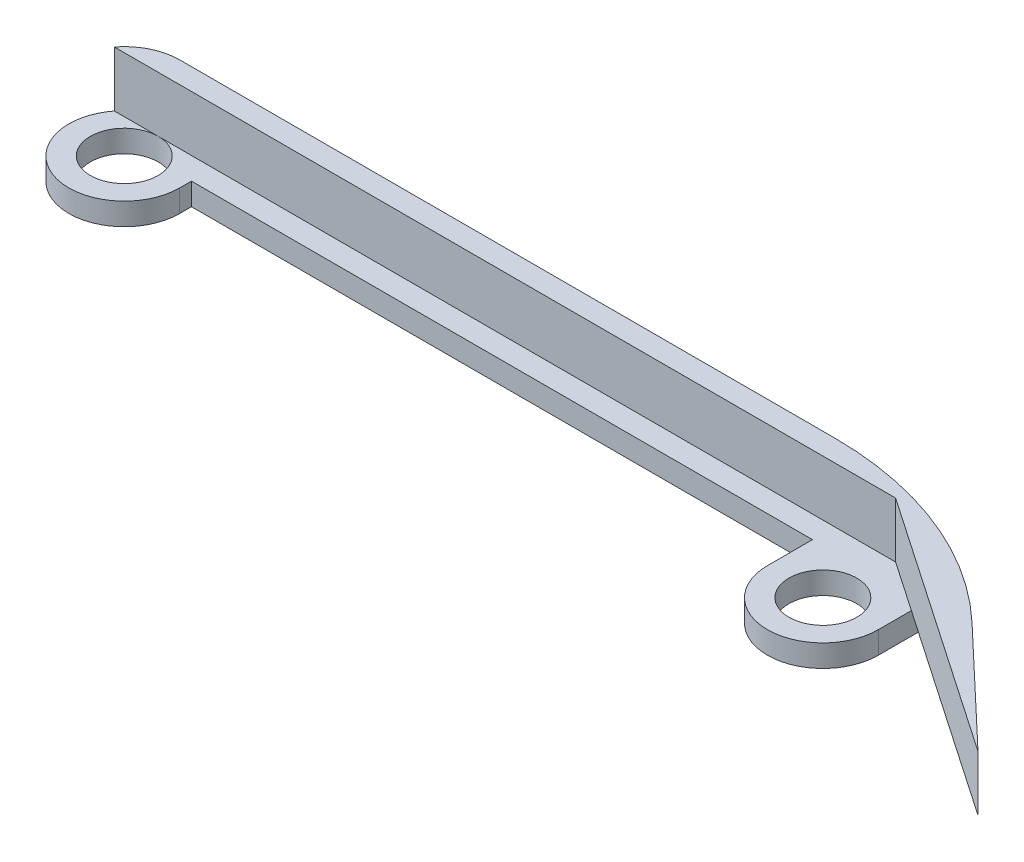
ISO-10303-21;
HEADER;
FILE_DESCRIPTION(('STEP AP214'),'2;1');
FILE_NAME('part.step','',(''),(''),'','','');
FILE_SCHEMA(('AUTOMOTIVE_DESIGN { 1 0 10303 214 1 1 1 1 }'));
ENDSEC;
DATA;
#1=APPLICATION_CONTEXT('core data for automotive mechanical design processes');
#2=APPLICATION_PROTOCOL_DEFINITION('international standard','automotive_design',2000,#1);
#3=PRODUCT_CONTEXT('',#1,'mechanical');
#4=PRODUCT('Part','Part','',(#3));
#5=PRODUCT_RELATED_PRODUCT_CATEGORY('part','',(#4));
#6=PRODUCT_DEFINITION_FORMATION('','',#4);
#7=PRODUCT_DEFINITION_CONTEXT('part definition',#1,'design');
#8=PRODUCT_DEFINITION('design','',#6,#7);
#9=PRODUCT_DEFINITION_SHAPE('','',#8);
#10=(LENGTH_UNIT() NAMED_UNIT(*) SI_UNIT(.MILLI.,.METRE.));
#11=(NAMED_UNIT(*) PLANE_ANGLE_UNIT() SI_UNIT($,.RADIAN.));
#12=(NAMED_UNIT(*) SI_UNIT($,.STERADIAN.) SOLID_ANGLE_UNIT());
#13=UNCERTAINTY_MEASURE_WITH_UNIT(LENGTH_MEASURE(1.E-05),#10,'distance_accuracy_value','');
#14=(GEOMETRIC_REPRESENTATION_CONTEXT(3) GLOBAL_UNCERTAINTY_ASSIGNED_CONTEXT((#13)) GLOBAL_UNIT_ASSIGNED_CONTEXT((#10,
#11,#12)) REPRESENTATION_CONTEXT('',''));
#15=CARTESIAN_POINT('',(0.,0.,0.));
#16=DIRECTION('',(0.,0.,1.));
#17=DIRECTION('',(1.,0.,0.));
#18=AXIS2_PLACEMENT_3D('',#15,#16,#17);
#19=CARTESIAN_POINT('',(0.,2.,0.));
#20=DIRECTION('',(0.,-1.,0.));
#21=DIRECTION('',(0.,0.,-1.));
#22=AXIS2_PLACEMENT_3D('',#19,#20,#21);
#23=CYLINDRICAL_SURFACE('',#22,5.);
#24=DIRECTION('',(0.,-1.,0.));
#25=VECTOR('',#24,1.);
#26=CARTESIAN_POINT('',(-5.,2.,0.));
#27=LINE('',#26,#25);
#28=CARTESIAN_POINT('',(-5.,2.,0.));
#29=VERTEX_POINT('',#28);
#30=CARTESIAN_POINT('',(-5.,0.,0.));
#31=VERTEX_POINT('',#30);
#32=EDGE_CURVE('E173',#29,#31,#27,.T.);
#33=ORIENTED_EDGE('',*,*,#32,.F.);
#34=CARTESIAN_POINT('',(0.,2.,0.));
#35=DIRECTION('',(0.,1.,0.));
#36=DIRECTION('',(0.,0.,1.));
#37=AXIS2_PLACEMENT_3D('',#34,#35,#36);
#38=CIRCLE('',#37,5.);
#39=CARTESIAN_POINT('',(-3.95428881089887,2.,-3.06));
#40=VERTEX_POINT('',#39);
#41=EDGE_CURVE('E42',#40,#29,#38,.T.);
#42=ORIENTED_EDGE('',*,*,#41,.F.);
#43=DIRECTION('',(0.,-1.,0.));
#44=VECTOR('',#43,1.);
#45=CARTESIAN_POINT('',(-3.95428881089887,2.,-3.06));
#46=LINE('',#45,#44);
#47=CARTESIAN_POINT('',(-3.95428881089888,7.,-3.06));
#48=VERTEX_POINT('',#47);
#49=EDGE_CURVE('E52',#48,#40,#46,.T.);
#50=ORIENTED_EDGE('',*,*,#49,.F.);
#51=CARTESIAN_POINT('',(0.,7.,0.));
#52=DIRECTION('',(0.,-1.,0.));
#53=DIRECTION('',(0.,0.,-1.));
#54=AXIS2_PLACEMENT_3D('',#51,#52,#53);
#55=CIRCLE('',#54,5.);
#56=CARTESIAN_POINT('',(0.,7.,-5.));
#57=VERTEX_POINT('',#56);
#58=EDGE_CURVE('E207',#57,#48,#55,.F.);
#59=ORIENTED_EDGE('',*,*,#58,.F.);
#60=DIRECTION('',(0.,-1.,0.));
#61=VECTOR('',#60,1.);
#62=CARTESIAN_POINT('',(0.,2.,-5.));
#63=LINE('',#62,#61);
#64=CARTESIAN_POINT('',(0.,0.,-5.));
#65=VERTEX_POINT('',#64);
#66=EDGE_CURVE('E204',#65,#57,#63,.F.);
#67=ORIENTED_EDGE('',*,*,#66,.F.);
#68=CARTESIAN_POINT('',(0.,0.,0.));
#69=DIRECTION('',(0.,1.,0.));
#70=DIRECTION('',(0.,0.,1.));
#71=AXIS2_PLACEMENT_3D('',#68,#69,#70);
#72=CIRCLE('',#71,5.);
#73=EDGE_CURVE('E11',#31,#65,#72,.F.);
#74=ORIENTED_EDGE('',*,*,#73,.F.);
#75=EDGE_LOOP('',(#33,#42,#50,#59,#67,#74));
#76=FACE_BOUND('',#75,.T.);
#77=ADVANCED_FACE('F35',(#76),#23,.T.);
#78=CARTESIAN_POINT('',(59.0406027599759,2.,25.));
#79=DIRECTION('',(0.,1.,0.));
#80=DIRECTION('',(0.,0.,1.));
#81=AXIS2_PLACEMENT_3D('',#78,#79,#80);
#82=CYLINDRICAL_SURFACE('',#81,30.);
#83=DIRECTION('',(0.,-1.,0.));
#84=VECTOR('',#83,1.);
#85=CARTESIAN_POINT('',(59.0406027599759,2.,-5.));
#86=LINE('',#85,#84);
#87=CARTESIAN_POINT('',(59.0406027599759,7.,-5.));
#88=VERTEX_POINT('',#87);
#89=CARTESIAN_POINT('',(59.0406027599759,0.,-5.));
#90=VERTEX_POINT('',#89);
#91=EDGE_CURVE('E185',#88,#90,#86,.T.);
#92=ORIENTED_EDGE('',*,*,#91,.F.);
#93=CARTESIAN_POINT('',(59.0406027599759,7.,25.));
#94=DIRECTION('',(0.,-1.,0.));
#95=DIRECTION('',(0.,0.,-1.));
#96=AXIS2_PLACEMENT_3D('',#93,#94,#95);
#97=CIRCLE('',#96,30.);
#98=CARTESIAN_POINT('',(79.6794848489848,7.,3.22761964974919));
#99=VERTEX_POINT('',#98);
#100=EDGE_CURVE('E201',#99,#88,#97,.F.);
#101=ORIENTED_EDGE('',*,*,#100,.F.);
#102=DIRECTION('',(0.,-1.,0.));
#103=VECTOR('',#102,1.);
#104=CARTESIAN_POINT('',(79.6794848489848,2.,3.22761964974919));
#105=LINE('',#104,#103);
#106=CARTESIAN_POINT('',(79.6794848489848,2.,3.22761964974919));
#107=VERTEX_POINT('',#106);
#108=EDGE_CURVE('E198',#107,#99,#105,.F.);
#109=ORIENTED_EDGE('',*,*,#108,.F.);
#110=CARTESIAN_POINT('',(59.0406027599759,2.,25.));
#111=DIRECTION('',(0.,-1.,0.));
#112=DIRECTION('',(0.,0.,-1.));
#113=AXIS2_PLACEMENT_3D('',#110,#111,#112);
#114=CIRCLE('',#113,30.);
#115=CARTESIAN_POINT('',(71.,2.,-2.5131390003995));
#116=VERTEX_POINT('',#115);
#117=EDGE_CURVE('E195',#116,#107,#114,.T.);
#118=ORIENTED_EDGE('',*,*,#117,.F.);
#119=DIRECTION('',(0.,1.,0.));
#120=VECTOR('',#119,1.);
#121=CARTESIAN_POINT('',(71.,2.,-2.5131390003995));
#122=LINE('',#121,#120);
#123=CARTESIAN_POINT('',(71.,0.,-2.5131390003995));
#124=VERTEX_POINT('',#123);
#125=EDGE_CURVE('E192',#124,#116,#122,.T.);
#126=ORIENTED_EDGE('',*,*,#125,.F.);
#127=CARTESIAN_POINT('',(59.0406027599759,0.,25.));
#128=DIRECTION('',(0.,1.,0.));
#129=DIRECTION('',(0.,0.,1.));
#130=AXIS2_PLACEMENT_3D('',#127,#128,#129);
#131=CIRCLE('',#130,30.);
#132=EDGE_CURVE('E188',#90,#124,#131,.F.);
#133=ORIENTED_EDGE('',*,*,#132,.F.);
#134=EDGE_LOOP('',(#92,#101,#109,#118,#126,#133));
#135=FACE_BOUND('',#134,.T.);
#136=ADVANCED_FACE('F246',(#135),#82,.T.);
#137=CARTESIAN_POINT('',(0.,2.,0.));
#138=DIRECTION('',(0.,1.,0.));
#139=DIRECTION('',(0.,0.,1.));
#140=AXIS2_PLACEMENT_3D('',#137,#138,#139);
#141=PLANE('',#140);
#142=DIRECTION('',(-1.,0.,0.));
#143=VECTOR('',#142,1.);
#144=CARTESIAN_POINT('',(66.5,2.,-3.06));
#145=LINE('',#144,#143);
#146=CARTESIAN_POINT('',(0.,2.,-3.06));
#147=VERTEX_POINT('',#146);
#148=EDGE_CURVE('E184',#147,#40,#145,.T.);
#149=ORIENTED_EDGE('',*,*,#148,.T.);
#150=ORIENTED_EDGE('',*,*,#41,.T.);
#151=CARTESIAN_POINT('',(0.,2.,0.));
#152=DIRECTION('',(0.,1.,0.));
#153=DIRECTION('',(0.,0.,1.));
#154=AXIS2_PLACEMENT_3D('',#151,#152,#153);
#155=CIRCLE('',#154,5.);
#156=CARTESIAN_POINT('',(5.,2.,0.));
#157=VERTEX_POINT('',#156);
#158=EDGE_CURVE('E172',#29,#157,#155,.T.);
#159=ORIENTED_EDGE('',*,*,#158,.T.);
#160=DIRECTION('',(0.,0.,-1.));
#161=VECTOR('',#160,1.);
#162=CARTESIAN_POINT('',(5.,2.,0.));
#163=LINE('',#162,#161);
#164=CARTESIAN_POINT('',(5.,2.,-1.06));
#165=VERTEX_POINT('',#164);
#166=EDGE_CURVE('E219',#157,#165,#163,.T.);
#167=ORIENTED_EDGE('',*,*,#166,.T.);
#168=DIRECTION('',(-1.,0.,0.));
#169=VECTOR('',#168,1.);
#170=CARTESIAN_POINT('',(5.,2.,-1.06));
#171=LINE('',#170,#169);
#172=CARTESIAN_POINT('',(61.,2.,-1.05999999999999));
#173=VERTEX_POINT('',#172);
#174=EDGE_CURVE('E136',#173,#165,#171,.T.);
#175=ORIENTED_EDGE('',*,*,#174,.F.);
#176=DIRECTION('',(0.,0.,1.));
#177=VECTOR('',#176,1.);
#178=CARTESIAN_POINT('',(61.,2.,3.));
#179=LINE('',#178,#177);
#180=CARTESIAN_POINT('',(61.,2.,3.));
#181=VERTEX_POINT('',#180);
#182=EDGE_CURVE('E221',#173,#181,#179,.T.);
#183=ORIENTED_EDGE('',*,*,#182,.T.);
#184=CARTESIAN_POINT('',(66.,2.,3.));
#185=DIRECTION('',(0.,1.,0.));
#186=DIRECTION('',(0.,0.,1.));
#187=AXIS2_PLACEMENT_3D('',#184,#185,#186);
#188=CIRCLE('',#187,5.);
#189=CARTESIAN_POINT('',(71.,2.,3.));
#190=VERTEX_POINT('',#189);
#191=EDGE_CURVE('E228',#181,#190,#188,.T.);
#192=ORIENTED_EDGE('',*,*,#191,.T.);
#193=DIRECTION('',(0.,0.,-1.));
#194=VECTOR('',#193,1.);
#195=CARTESIAN_POINT('',(71.,2.,3.));
#196=LINE('',#195,#194);
#197=CARTESIAN_POINT('',(71.,2.,0.0173940210042682));
#198=VERTEX_POINT('',#197);
#199=EDGE_CURVE('E177',#190,#198,#196,.T.);
#200=ORIENTED_EDGE('',*,*,#199,.T.);
#201=DIRECTION('',(-0.825440027612297,0.,-0.564489823482594));
#202=VECTOR('',#201,1.);
#203=CARTESIAN_POINT('',(90.0000000000156,2.,13.0108354430329));
#204=LINE('',#203,#202);
#205=CARTESIAN_POINT('',(66.5,2.,-3.06));
#206=VERTEX_POINT('',#205);
#207=EDGE_CURVE('E189',#198,#206,#204,.T.);
#208=ORIENTED_EDGE('',*,*,#207,.T.);
#209=EDGE_CURVE('E275',#206,#147,#145,.T.);
#210=ORIENTED_EDGE('',*,*,#209,.T.);
#211=CARTESIAN_POINT('',(0.,2.,0.));
#212=DIRECTION('',(0.,1.,0.));
#213=DIRECTION('',(0.,0.,1.));
#214=AXIS2_PLACEMENT_3D('',#211,#212,#213);
#215=CIRCLE('',#214,3.06);
#216=EDGE_CURVE('E161',#147,#147,#215,.T.);
#217=ORIENTED_EDGE('',*,*,#216,.F.);
#218=EDGE_LOOP('',(#149,#150,#159,#167,#175,#183,#192,#200,#208,#210,#217));
#219=FACE_BOUND('',#218,.T.);
#220=CARTESIAN_POINT('',(66.,2.,3.));
#221=DIRECTION('',(0.,1.,0.));
#222=DIRECTION('',(0.,0.,1.));
#223=AXIS2_PLACEMENT_3D('',#220,#221,#222);
#224=CIRCLE('',#223,3.06);
#225=CARTESIAN_POINT('',(66.,2.,6.06));
#226=VERTEX_POINT('',#225);
#227=EDGE_CURVE('E283',#226,#226,#224,.T.);
#228=ORIENTED_EDGE('',*,*,#227,.F.);
#229=EDGE_LOOP('',(#228));
#230=FACE_BOUND('',#229,.T.);
#231=ADVANCED_FACE('F212',(#219,#230),#141,.T.);
#232=CARTESIAN_POINT('',(0.,0.,0.));
#233=DIRECTION('',(0.,1.,0.));
#234=DIRECTION('',(0.,0.,1.));
#235=AXIS2_PLACEMENT_3D('',#232,#233,#234);
#236=PLANE('',#235);
#237=CARTESIAN_POINT('',(0.,0.,0.));
#238=DIRECTION('',(0.,1.,0.));
#239=DIRECTION('',(0.,0.,1.));
#240=AXIS2_PLACEMENT_3D('',#237,#238,#239);
#241=CIRCLE('',#240,5.);
#242=CARTESIAN_POINT('',(5.,0.,0.));
#243=VERTEX_POINT('',#242);
#244=EDGE_CURVE('E157',#31,#243,#241,.T.);
#245=ORIENTED_EDGE('',*,*,#244,.F.);
#246=ORIENTED_EDGE('',*,*,#73,.T.);
#247=DIRECTION('',(-1.,0.,0.));
#248=VECTOR('',#247,1.);
#249=CARTESIAN_POINT('',(-5.,0.,-5.));
#250=LINE('',#249,#248);
#251=EDGE_CURVE('E169',#90,#65,#250,.T.);
#252=ORIENTED_EDGE('',*,*,#251,.F.);
#253=ORIENTED_EDGE('',*,*,#132,.T.);
#254=DIRECTION('',(0.,0.,-1.));
#255=VECTOR('',#254,1.);
#256=CARTESIAN_POINT('',(71.,0.,3.));
#257=LINE('',#256,#255);
#258=CARTESIAN_POINT('',(71.,0.,3.));
#259=VERTEX_POINT('',#258);
#260=EDGE_CURVE('E166',#259,#124,#257,.T.);
#261=ORIENTED_EDGE('',*,*,#260,.F.);
#262=CARTESIAN_POINT('',(66.,0.,3.));
#263=DIRECTION('',(0.,1.,0.));
#264=DIRECTION('',(0.,0.,1.));
#265=AXIS2_PLACEMENT_3D('',#262,#263,#264);
#266=CIRCLE('',#265,5.);
#267=CARTESIAN_POINT('',(61.,0.,3.));
#268=VERTEX_POINT('',#267);
#269=EDGE_CURVE('E159',#268,#259,#266,.T.);
#270=ORIENTED_EDGE('',*,*,#269,.F.);
#271=DIRECTION('',(0.,0.,1.));
#272=VECTOR('',#271,1.);
#273=CARTESIAN_POINT('',(61.,0.,3.));
#274=LINE('',#273,#272);
#275=CARTESIAN_POINT('',(61.,0.,-1.05999999999999));
#276=VERTEX_POINT('',#275);
#277=EDGE_CURVE('E150',#276,#268,#274,.T.);
#278=ORIENTED_EDGE('',*,*,#277,.F.);
#279=DIRECTION('',(-1.,0.,0.));
#280=VECTOR('',#279,1.);
#281=CARTESIAN_POINT('',(5.,0.,-1.06));
#282=LINE('',#281,#280);
#283=CARTESIAN_POINT('',(5.,0.,-1.06));
#284=VERTEX_POINT('',#283);
#285=EDGE_CURVE('E134',#276,#284,#282,.T.);
#286=ORIENTED_EDGE('',*,*,#285,.T.);
#287=DIRECTION('',(0.,0.,-1.));
#288=VECTOR('',#287,1.);
#289=CARTESIAN_POINT('',(5.,0.,0.));
#290=LINE('',#289,#288);
#291=EDGE_CURVE('E147',#243,#284,#290,.T.);
#292=ORIENTED_EDGE('',*,*,#291,.F.);
#293=EDGE_LOOP('',(#245,#246,#252,#253,#261,#270,#278,#286,#292));
#294=FACE_BOUND('',#293,.T.);
#295=CARTESIAN_POINT('',(0.,0.,0.));
#296=DIRECTION('',(0.,1.,0.));
#297=DIRECTION('',(0.,0.,1.));
#298=AXIS2_PLACEMENT_3D('',#295,#296,#297);
#299=CIRCLE('',#298,3.06);
#300=CARTESIAN_POINT('',(0.,0.,3.06));
#301=VERTEX_POINT('',#300);
#302=EDGE_CURVE('E224',#301,#301,#299,.T.);
#303=ORIENTED_EDGE('',*,*,#302,.T.);
#304=EDGE_LOOP('',(#303));
#305=FACE_BOUND('',#304,.T.);
#306=CARTESIAN_POINT('',(66.,0.,3.));
#307=DIRECTION('',(0.,1.,0.));
#308=DIRECTION('',(0.,0.,1.));
#309=AXIS2_PLACEMENT_3D('',#306,#307,#308);
#310=CIRCLE('',#309,3.06);
#311=CARTESIAN_POINT('',(66.,0.,6.06));
#312=VERTEX_POINT('',#311);
#313=EDGE_CURVE('E281',#312,#312,#310,.T.);
#314=ORIENTED_EDGE('',*,*,#313,.T.);
#315=EDGE_LOOP('',(#314));
#316=FACE_BOUND('',#315,.T.);
#317=ADVANCED_FACE('F145',(#294,#305,#316),#236,.F.);
#318=CARTESIAN_POINT('',(0.,2.,0.));
#319=DIRECTION('',(0.,-1.,0.));
#320=DIRECTION('',(0.,0.,-1.));
#321=AXIS2_PLACEMENT_3D('',#318,#319,#320);
#322=CYLINDRICAL_SURFACE('',#321,5.);
#323=ORIENTED_EDGE('',*,*,#244,.T.);
#324=DIRECTION('',(0.,-1.,0.));
#325=VECTOR('',#324,1.);
#326=CARTESIAN_POINT('',(5.,2.,0.));
#327=LINE('',#326,#325);
#328=EDGE_CURVE('E155',#157,#243,#327,.T.);
#329=ORIENTED_EDGE('',*,*,#328,.F.);
#330=ORIENTED_EDGE('',*,*,#158,.F.);
#331=ORIENTED_EDGE('',*,*,#32,.T.);
#332=EDGE_LOOP('',(#323,#329,#330,#331));
#333=FACE_BOUND('',#332,.T.);
#334=ADVANCED_FACE('F218',(#333),#322,.T.);
#335=CARTESIAN_POINT('',(5.,2.,0.));
#336=DIRECTION('',(-1.,0.,0.));
#337=DIRECTION('',(0.,0.,1.));
#338=AXIS2_PLACEMENT_3D('',#335,#336,#337);
#339=PLANE('',#338);
#340=ORIENTED_EDGE('',*,*,#291,.T.);
#341=DIRECTION('',(0.,-1.,0.));
#342=VECTOR('',#341,1.);
#343=CARTESIAN_POINT('',(5.,58.0357029044876,-1.06));
#344=LINE('',#343,#342);
#345=EDGE_CURVE('E130',#165,#284,#344,.T.);
#346=ORIENTED_EDGE('',*,*,#345,.F.);
#347=ORIENTED_EDGE('',*,*,#166,.F.);
#348=ORIENTED_EDGE('',*,*,#328,.T.);
#349=EDGE_LOOP('',(#340,#346,#347,#348));
#350=FACE_BOUND('',#349,.T.);
#351=ADVANCED_FACE('F153',(#350),#339,.F.);
#352=CARTESIAN_POINT('',(5.,2.,-3.06));
#353=DIRECTION('',(0.,0.,-1.));
#354=DIRECTION('',(-1.,0.,0.));
#355=AXIS2_PLACEMENT_3D('',#352,#353,#354);
#356=PLANE('',#355);
#357=DIRECTION('',(-1.,0.,0.));
#358=VECTOR('',#357,1.);
#359=CARTESIAN_POINT('',(66.5,7.,-3.06));
#360=LINE('',#359,#358);
#361=CARTESIAN_POINT('',(66.5,7.,-3.06));
#362=VERTEX_POINT('',#361);
#363=EDGE_CURVE('E265',#362,#48,#360,.T.);
#364=ORIENTED_EDGE('',*,*,#363,.T.);
#365=ORIENTED_EDGE('',*,*,#49,.T.);
#366=ORIENTED_EDGE('',*,*,#148,.F.);
#367=ORIENTED_EDGE('',*,*,#209,.F.);
#368=DIRECTION('',(0.,-1.,0.));
#369=VECTOR('',#368,1.);
#370=CARTESIAN_POINT('',(66.5,7.,-3.06));
#371=LINE('',#370,#369);
#372=EDGE_CURVE('E278',#362,#206,#371,.T.);
#373=ORIENTED_EDGE('',*,*,#372,.F.);
#374=EDGE_LOOP('',(#364,#365,#366,#367,#373));
#375=FACE_BOUND('',#374,.T.);
#376=ADVANCED_FACE('F318',(#375),#356,.F.);
#377=CARTESIAN_POINT('',(61.,2.,3.));
#378=DIRECTION('',(1.,0.,0.));
#379=DIRECTION('',(0.,0.,-1.));
#380=AXIS2_PLACEMENT_3D('',#377,#378,#379);
#381=PLANE('',#380);
#382=ORIENTED_EDGE('',*,*,#182,.F.);
#383=DIRECTION('',(0.,-1.,0.));
#384=VECTOR('',#383,1.);
#385=CARTESIAN_POINT('',(61.,58.0357029044876,-1.05999999999999));
#386=LINE('',#385,#384);
#387=EDGE_CURVE('E151',#173,#276,#386,.T.);
#388=ORIENTED_EDGE('',*,*,#387,.T.);
#389=ORIENTED_EDGE('',*,*,#277,.T.);
#390=DIRECTION('',(0.,-1.,0.));
#391=VECTOR('',#390,1.);
#392=CARTESIAN_POINT('',(61.,2.,3.));
#393=LINE('',#392,#391);
#394=EDGE_CURVE('E180',#181,#268,#393,.T.);
#395=ORIENTED_EDGE('',*,*,#394,.F.);
#396=EDGE_LOOP('',(#382,#388,#389,#395));
#397=FACE_BOUND('',#396,.T.);
#398=ADVANCED_FACE('F321',(#397),#381,.F.);
#399=CARTESIAN_POINT('',(66.,2.,3.));
#400=DIRECTION('',(0.,-1.,0.));
#401=DIRECTION('',(0.,0.,-1.));
#402=AXIS2_PLACEMENT_3D('',#399,#400,#401);
#403=CYLINDRICAL_SURFACE('',#402,5.);
#404=ORIENTED_EDGE('',*,*,#269,.T.);
#405=DIRECTION('',(0.,-1.,0.));
#406=VECTOR('',#405,1.);
#407=CARTESIAN_POINT('',(71.,2.,3.));
#408=LINE('',#407,#406);
#409=EDGE_CURVE('E176',#190,#259,#408,.T.);
#410=ORIENTED_EDGE('',*,*,#409,.F.);
#411=ORIENTED_EDGE('',*,*,#191,.F.);
#412=ORIENTED_EDGE('',*,*,#394,.T.);
#413=EDGE_LOOP('',(#404,#410,#411,#412));
#414=FACE_BOUND('',#413,.T.);
#415=ADVANCED_FACE('F325',(#414),#403,.T.);
#416=CARTESIAN_POINT('',(71.,2.,3.));
#417=DIRECTION('',(-1.,0.,0.));
#418=DIRECTION('',(0.,0.,1.));
#419=AXIS2_PLACEMENT_3D('',#416,#417,#418);
#420=PLANE('',#419);
#421=ORIENTED_EDGE('',*,*,#260,.T.);
#422=ORIENTED_EDGE('',*,*,#125,.T.);
#423=EDGE_CURVE('E229',#198,#116,#196,.T.);
#424=ORIENTED_EDGE('',*,*,#423,.F.);
#425=ORIENTED_EDGE('',*,*,#199,.F.);
#426=ORIENTED_EDGE('',*,*,#409,.T.);
#427=EDGE_LOOP('',(#421,#422,#424,#425,#426));
#428=FACE_BOUND('',#427,.T.);
#429=ADVANCED_FACE('F242',(#428),#420,.F.);
#430=CARTESIAN_POINT('',(-5.,2.,-5.));
#431=DIRECTION('',(0.,0.,1.));
#432=DIRECTION('',(1.,0.,0.));
#433=AXIS2_PLACEMENT_3D('',#430,#431,#432);
#434=PLANE('',#433);
#435=ORIENTED_EDGE('',*,*,#251,.T.);
#436=ORIENTED_EDGE('',*,*,#66,.T.);
#437=DIRECTION('',(1.,0.,0.));
#438=VECTOR('',#437,1.);
#439=CARTESIAN_POINT('',(-5.,7.,-5.));
#440=LINE('',#439,#438);
#441=EDGE_CURVE('E251',#57,#88,#440,.T.);
#442=ORIENTED_EDGE('',*,*,#441,.T.);
#443=ORIENTED_EDGE('',*,*,#91,.T.);
#444=EDGE_LOOP('',(#435,#436,#442,#443));
#445=FACE_BOUND('',#444,.T.);
#446=ADVANCED_FACE('F249',(#445),#434,.F.);
#447=CARTESIAN_POINT('',(0.,2.,0.));
#448=DIRECTION('',(0.,-1.,0.));
#449=DIRECTION('',(0.,0.,-1.));
#450=AXIS2_PLACEMENT_3D('',#447,#448,#449);
#451=CYLINDRICAL_SURFACE('',#450,3.06);
#452=ORIENTED_EDGE('',*,*,#216,.T.);
#453=EDGE_LOOP('',(#452));
#454=FACE_BOUND('',#453,.T.);
#455=ORIENTED_EDGE('',*,*,#302,.F.);
#456=EDGE_LOOP('',(#455));
#457=FACE_BOUND('',#456,.T.);
#458=ADVANCED_FACE('F293',(#454,#457),#451,.F.);
#459=CARTESIAN_POINT('',(66.,2.,3.));
#460=DIRECTION('',(0.,-1.,0.));
#461=DIRECTION('',(0.,0.,-1.));
#462=AXIS2_PLACEMENT_3D('',#459,#460,#461);
#463=CYLINDRICAL_SURFACE('',#462,3.06);
#464=ORIENTED_EDGE('',*,*,#227,.T.);
#465=EDGE_LOOP('',(#464));
#466=FACE_BOUND('',#465,.T.);
#467=ORIENTED_EDGE('',*,*,#313,.F.);
#468=EDGE_LOOP('',(#467));
#469=FACE_BOUND('',#468,.T.);
#470=ADVANCED_FACE('F295',(#466,#469),#463,.F.);
#471=CARTESIAN_POINT('',(90.0000000000156,7.,13.0108354430329));
#472=DIRECTION('',(-0.564489823482595,0.,0.825440027612297));
#473=DIRECTION('',(0.825440027612297,0.,0.564489823482595));
#474=AXIS2_PLACEMENT_3D('',#471,#472,#473);
#475=PLANE('',#474);
#476=CARTESIAN_POINT('',(90.0000000000156,2.,13.0108354430329));
#477=VERTEX_POINT('',#476);
#478=EDGE_CURVE('E240',#477,#198,#204,.T.);
#479=ORIENTED_EDGE('',*,*,#478,.F.);
#480=DIRECTION('',(0.,-1.,0.));
#481=VECTOR('',#480,1.);
#482=CARTESIAN_POINT('',(90.0000000000156,7.,13.0108354430329));
#483=LINE('',#482,#481);
#484=CARTESIAN_POINT('',(90.0000000000156,7.,13.0108354430329));
#485=VERTEX_POINT('',#484);
#486=EDGE_CURVE('E272',#485,#477,#483,.T.);
#487=ORIENTED_EDGE('',*,*,#486,.F.);
#488=DIRECTION('',(-0.825440027612297,0.,-0.564489823482594));
#489=VECTOR('',#488,1.);
#490=CARTESIAN_POINT('',(90.0000000000156,7.,13.0108354430329));
#491=LINE('',#490,#489);
#492=EDGE_CURVE('E263',#485,#362,#491,.T.);
#493=ORIENTED_EDGE('',*,*,#492,.T.);
#494=ORIENTED_EDGE('',*,*,#372,.T.);
#495=ORIENTED_EDGE('',*,*,#207,.F.);
#496=EDGE_LOOP('',(#479,#487,#493,#494,#495));
#497=FACE_BOUND('',#496,.T.);
#498=ADVANCED_FACE('F301',(#497),#475,.T.);
#499=CARTESIAN_POINT('',(71.,7.,-5.));
#500=DIRECTION('',(0.687962736300297,0.,-0.725746011675027));
#501=DIRECTION('',(-0.725746011675027,0.,-0.687962736300297));
#502=AXIS2_PLACEMENT_3D('',#499,#500,#501);
#503=PLANE('',#502);
#504=DIRECTION('',(0.725746011675027,0.,0.687962736300297));
#505=VECTOR('',#504,1.);
#506=CARTESIAN_POINT('',(71.,2.,-5.));
#507=LINE('',#506,#505);
#508=EDGE_CURVE('E140',#107,#477,#507,.T.);
#509=ORIENTED_EDGE('',*,*,#508,.F.);
#510=ORIENTED_EDGE('',*,*,#108,.T.);
#511=DIRECTION('',(0.725746011675027,0.,0.687962736300297));
#512=VECTOR('',#511,1.);
#513=CARTESIAN_POINT('',(71.,7.,-5.));
#514=LINE('',#513,#512);
#515=EDGE_CURVE('E257',#99,#485,#514,.T.);
#516=ORIENTED_EDGE('',*,*,#515,.T.);
#517=ORIENTED_EDGE('',*,*,#486,.T.);
#518=EDGE_LOOP('',(#509,#510,#516,#517));
#519=FACE_BOUND('',#518,.T.);
#520=ADVANCED_FACE('F255',(#519),#503,.T.);
#521=CARTESIAN_POINT('',(0.,7.,0.));
#522=DIRECTION('',(0.,-1.,0.));
#523=DIRECTION('',(0.,0.,-1.));
#524=AXIS2_PLACEMENT_3D('',#521,#522,#523);
#525=PLANE('',#524);
#526=ORIENTED_EDGE('',*,*,#441,.F.);
#527=ORIENTED_EDGE('',*,*,#58,.T.);
#528=ORIENTED_EDGE('',*,*,#363,.F.);
#529=ORIENTED_EDGE('',*,*,#492,.F.);
#530=ORIENTED_EDGE('',*,*,#515,.F.);
#531=ORIENTED_EDGE('',*,*,#100,.T.);
#532=EDGE_LOOP('',(#526,#527,#528,#529,#530,#531));
#533=FACE_BOUND('',#532,.T.);
#534=ADVANCED_FACE('F260',(#533),#525,.F.);
#535=CARTESIAN_POINT('',(0.,2.,0.));
#536=DIRECTION('',(0.,-1.,0.));
#537=DIRECTION('',(0.,0.,-1.));
#538=AXIS2_PLACEMENT_3D('',#535,#536,#537);
#539=PLANE('',#538);
#540=ORIENTED_EDGE('',*,*,#423,.T.);
#541=ORIENTED_EDGE('',*,*,#117,.T.);
#542=ORIENTED_EDGE('',*,*,#508,.T.);
#543=ORIENTED_EDGE('',*,*,#478,.T.);
#544=EDGE_LOOP('',(#540,#541,#542,#543));
#545=FACE_BOUND('',#544,.T.);
#546=ADVANCED_FACE('F237',(#545),#539,.T.);
#547=CARTESIAN_POINT('',(5.,58.0357029044876,-1.06));
#548=DIRECTION('',(0.,0.,1.));
#549=DIRECTION('',(1.,0.,0.));
#550=AXIS2_PLACEMENT_3D('',#547,#548,#549);
#551=PLANE('',#550);
#552=ORIENTED_EDGE('',*,*,#387,.F.);
#553=ORIENTED_EDGE('',*,*,#174,.T.);
#554=ORIENTED_EDGE('',*,*,#345,.T.);
#555=ORIENTED_EDGE('',*,*,#285,.F.);
#556=EDGE_LOOP('',(#552,#553,#554,#555));
#557=FACE_BOUND('',#556,.T.);
#558=ADVANCED_FACE('F133',(#557),#551,.T.);
#559=CLOSED_SHELL('',(#77,#136,#231,#317,#334,#351,#376,#398,#415,#429,#446,#458,#470,#498,#520,
#534,#546,#558));
#560=MANIFOLD_SOLID_BREP('B2',#559);
#561=ADVANCED_BREP_SHAPE_REPRESENTATION('',(#18,#560),#14);
#562=SHAPE_DEFINITION_REPRESENTATION(#9,#561);
ENDSEC;
END-ISO-10303-21;
